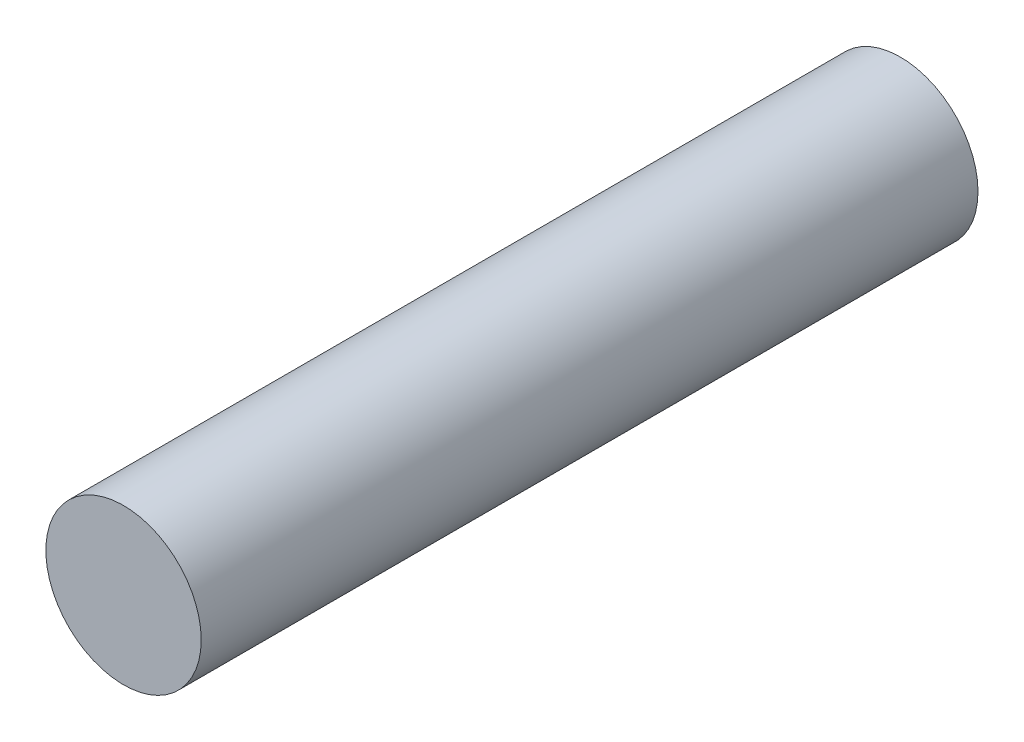
ISO-10303-21;
HEADER;
FILE_DESCRIPTION(('STEP AP214'),'2;1');
FILE_NAME('part.step','',(''),(''),'','','');
FILE_SCHEMA(('AUTOMOTIVE_DESIGN { 1 0 10303 214 1 1 1 1 }'));
ENDSEC;
DATA;
#1=APPLICATION_CONTEXT('core data for automotive mechanical design processes');
#2=APPLICATION_PROTOCOL_DEFINITION('international standard','automotive_design',2000,#1);
#3=PRODUCT_CONTEXT('',#1,'mechanical');
#4=PRODUCT('Part','Part','',(#3));
#5=PRODUCT_RELATED_PRODUCT_CATEGORY('part','',(#4));
#6=PRODUCT_DEFINITION_FORMATION('','',#4);
#7=PRODUCT_DEFINITION_CONTEXT('part definition',#1,'design');
#8=PRODUCT_DEFINITION('design','',#6,#7);
#9=PRODUCT_DEFINITION_SHAPE('','',#8);
#10=(LENGTH_UNIT() NAMED_UNIT(*) SI_UNIT(.MILLI.,.METRE.));
#11=(NAMED_UNIT(*) PLANE_ANGLE_UNIT() SI_UNIT($,.RADIAN.));
#12=(NAMED_UNIT(*) SI_UNIT($,.STERADIAN.) SOLID_ANGLE_UNIT());
#13=UNCERTAINTY_MEASURE_WITH_UNIT(LENGTH_MEASURE(1.E-05),#10,'distance_accuracy_value','');
#14=(GEOMETRIC_REPRESENTATION_CONTEXT(3) GLOBAL_UNCERTAINTY_ASSIGNED_CONTEXT((#13)) GLOBAL_UNIT_ASSIGNED_CONTEXT((#10,
#11,#12)) REPRESENTATION_CONTEXT('',''));
#15=CARTESIAN_POINT('',(0.,0.,0.));
#16=DIRECTION('',(0.,0.,1.));
#17=DIRECTION('',(1.,0.,0.));
#18=AXIS2_PLACEMENT_3D('',#15,#16,#17);
#19=CARTESIAN_POINT('',(0.,0.,10.));
#20=DIRECTION('',(0.,0.,-1.));
#21=DIRECTION('',(-1.,0.,0.));
#22=AXIS2_PLACEMENT_3D('',#19,#20,#21);
#23=CYLINDRICAL_SURFACE('',#22,1.);
#24=CARTESIAN_POINT('',(0.,0.,10.));
#25=DIRECTION('',(0.,0.,1.));
#26=DIRECTION('',(1.,0.,0.));
#27=AXIS2_PLACEMENT_3D('',#24,#25,#26);
#28=CIRCLE('',#27,1.);
#29=CARTESIAN_POINT('',(1.,0.,10.));
#30=VERTEX_POINT('',#29);
#31=EDGE_CURVE('E10',#30,#30,#28,.T.);
#32=ORIENTED_EDGE('',*,*,#31,.F.);
#33=EDGE_LOOP('',(#32));
#34=FACE_BOUND('',#33,.T.);
#35=CARTESIAN_POINT('',(0.,0.,0.));
#36=DIRECTION('',(0.,0.,1.));
#37=DIRECTION('',(1.,0.,0.));
#38=AXIS2_PLACEMENT_3D('',#35,#36,#37);
#39=CIRCLE('',#38,1.);
#40=CARTESIAN_POINT('',(1.,0.,0.));
#41=VERTEX_POINT('',#40);
#42=EDGE_CURVE('E33',#41,#41,#39,.T.);
#43=ORIENTED_EDGE('',*,*,#42,.T.);
#44=EDGE_LOOP('',(#43));
#45=FACE_BOUND('',#44,.T.);
#46=ADVANCED_FACE('F30',(#34,#45),#23,.T.);
#47=CARTESIAN_POINT('',(0.,0.,10.));
#48=DIRECTION('',(0.,0.,1.));
#49=DIRECTION('',(1.,0.,0.));
#50=AXIS2_PLACEMENT_3D('',#47,#48,#49);
#51=PLANE('',#50);
#52=ORIENTED_EDGE('',*,*,#31,.T.);
#53=EDGE_LOOP('',(#52));
#54=FACE_BOUND('',#53,.T.);
#55=ADVANCED_FACE('F45',(#54),#51,.T.);
#56=CARTESIAN_POINT('',(0.,0.,0.));
#57=DIRECTION('',(0.,0.,1.));
#58=DIRECTION('',(1.,0.,0.));
#59=AXIS2_PLACEMENT_3D('',#56,#57,#58);
#60=PLANE('',#59);
#61=ORIENTED_EDGE('',*,*,#42,.F.);
#62=EDGE_LOOP('',(#61));
#63=FACE_BOUND('',#62,.T.);
#64=ADVANCED_FACE('F43',(#63),#60,.F.);
#65=CLOSED_SHELL('',(#46,#55,#64));
#66=MANIFOLD_SOLID_BREP('B2',#65);
#67=ADVANCED_BREP_SHAPE_REPRESENTATION('',(#18,#66),#14);
#68=SHAPE_DEFINITION_REPRESENTATION(#9,#67);
ENDSEC;
END-ISO-10303-21;
